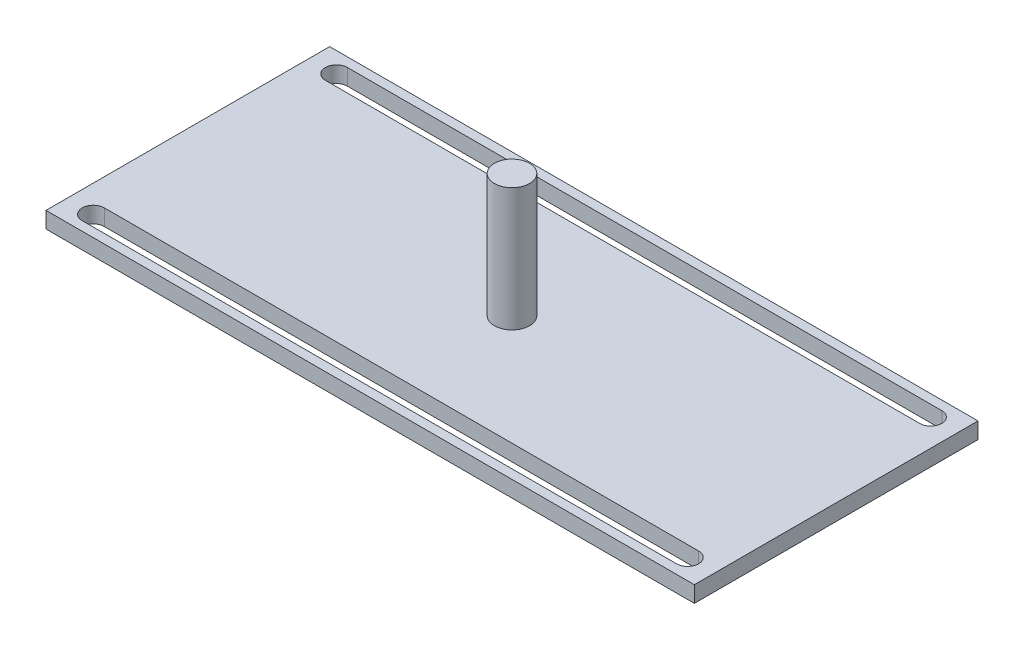
ISO-10303-21;
HEADER;
FILE_DESCRIPTION(('STEP AP214'),'2;1');
FILE_NAME('part.step','',(''),(''),'','','');
FILE_SCHEMA(('AUTOMOTIVE_DESIGN { 1 0 10303 214 1 1 1 1 }'));
ENDSEC;
DATA;
#1=APPLICATION_CONTEXT('core data for automotive mechanical design processes');
#2=APPLICATION_PROTOCOL_DEFINITION('international standard','automotive_design',2000,#1);
#3=PRODUCT_CONTEXT('',#1,'mechanical');
#4=PRODUCT('Part','Part','',(#3));
#5=PRODUCT_RELATED_PRODUCT_CATEGORY('part','',(#4));
#6=PRODUCT_DEFINITION_FORMATION('','',#4);
#7=PRODUCT_DEFINITION_CONTEXT('part definition',#1,'design');
#8=PRODUCT_DEFINITION('design','',#6,#7);
#9=PRODUCT_DEFINITION_SHAPE('','',#8);
#10=(LENGTH_UNIT() NAMED_UNIT(*) SI_UNIT(.MILLI.,.METRE.));
#11=(NAMED_UNIT(*) PLANE_ANGLE_UNIT() SI_UNIT($,.RADIAN.));
#12=(NAMED_UNIT(*) SI_UNIT($,.STERADIAN.) SOLID_ANGLE_UNIT());
#13=UNCERTAINTY_MEASURE_WITH_UNIT(LENGTH_MEASURE(1.E-05),#10,'distance_accuracy_value','');
#14=(GEOMETRIC_REPRESENTATION_CONTEXT(3) GLOBAL_UNCERTAINTY_ASSIGNED_CONTEXT((#13)) GLOBAL_UNIT_ASSIGNED_CONTEXT((#10,
#11,#12)) REPRESENTATION_CONTEXT('',''));
#15=CARTESIAN_POINT('',(0.,0.,0.));
#16=DIRECTION('',(0.,0.,1.));
#17=DIRECTION('',(1.,0.,0.));
#18=AXIS2_PLACEMENT_3D('',#15,#16,#17);
#19=CARTESIAN_POINT('',(0.,6.,0.));
#20=DIRECTION('',(0.,1.,0.));
#21=DIRECTION('',(0.,0.,1.));
#22=AXIS2_PLACEMENT_3D('',#19,#20,#21);
#23=PLANE('',#22);
#24=CARTESIAN_POINT('',(24.5236212747906,6.,-78.038808084481));
#25=DIRECTION('',(0.,1.,0.));
#26=DIRECTION('',(0.,0.,1.));
#27=AXIS2_PLACEMENT_3D('',#24,#25,#26);
#28=CIRCLE('',#27,4.09999999999998);
#29=CARTESIAN_POINT('',(24.5236212747906,6.00000000000001,-73.938808084481));
#30=VERTEX_POINT('',#29);
#31=CARTESIAN_POINT('',(24.5236212747906,6.00000000000001,-82.138808084481));
#32=VERTEX_POINT('',#31);
#33=EDGE_CURVE('E207',#30,#32,#28,.T.);
#34=ORIENTED_EDGE('',*,*,#33,.F.);
#35=DIRECTION('',(-1.,0.,0.));
#36=VECTOR('',#35,1.);
#37=CARTESIAN_POINT('',(0.,6.,-73.938808084481));
#38=LINE('',#37,#36);
#39=CARTESIAN_POINT('',(-195.476378725209,6.00000000000001,-73.938808084481));
#40=VERTEX_POINT('',#39);
#41=EDGE_CURVE('E237',#30,#40,#38,.T.);
#42=ORIENTED_EDGE('',*,*,#41,.T.);
#43=CARTESIAN_POINT('',(-195.476378725209,6.,-78.038808084481));
#44=DIRECTION('',(0.,1.,0.));
#45=DIRECTION('',(0.,0.,1.));
#46=AXIS2_PLACEMENT_3D('',#43,#44,#45);
#47=CIRCLE('',#46,4.09999999999998);
#48=CARTESIAN_POINT('',(-195.476378725209,6.,-82.138808084481));
#49=VERTEX_POINT('',#48);
#50=EDGE_CURVE('E172',#49,#40,#47,.T.);
#51=ORIENTED_EDGE('',*,*,#50,.F.);
#52=DIRECTION('',(1.,0.,0.));
#53=VECTOR('',#52,1.);
#54=CARTESIAN_POINT('',(0.,6.,-82.138808084481));
#55=LINE('',#54,#53);
#56=EDGE_CURVE('E67',#49,#32,#55,.T.);
#57=ORIENTED_EDGE('',*,*,#56,.T.);
#58=EDGE_LOOP('',(#34,#42,#51,#57));
#59=FACE_BOUND('',#58,.T.);
#60=CARTESIAN_POINT('',(-85.4763787252094,6.,-33.038808084481));
#61=DIRECTION('',(0.,1.,0.));
#62=DIRECTION('',(0.,0.,1.));
#63=AXIS2_PLACEMENT_3D('',#60,#61,#62);
#64=CIRCLE('',#63,6.5);
#65=CARTESIAN_POINT('',(-85.4763787252094,6.,-26.538808084481));
#66=VERTEX_POINT('',#65);
#67=EDGE_CURVE('E163',#66,#66,#64,.T.);
#68=ORIENTED_EDGE('',*,*,#67,.F.);
#69=EDGE_LOOP('',(#68));
#70=FACE_BOUND('',#69,.T.);
#71=DIRECTION('',(0.,0.,1.));
#72=VECTOR('',#71,1.);
#73=CARTESIAN_POINT('',(-205.476378725209,6.,-85.538808084481));
#74=LINE('',#73,#72);
#75=CARTESIAN_POINT('',(-205.476378725209,6.,-85.538808084481));
#76=VERTEX_POINT('',#75);
#77=CARTESIAN_POINT('',(-205.476378725209,6.,19.461191915519));
#78=VERTEX_POINT('',#77);
#79=EDGE_CURVE('E178',#76,#78,#74,.T.);
#80=ORIENTED_EDGE('',*,*,#79,.T.);
#81=DIRECTION('',(1.,0.,0.));
#82=VECTOR('',#81,1.);
#83=CARTESIAN_POINT('',(-205.476378725209,6.,19.461191915519));
#84=LINE('',#83,#82);
#85=CARTESIAN_POINT('',(34.5236212747906,6.,19.461191915519));
#86=VERTEX_POINT('',#85);
#87=EDGE_CURVE('E181',#78,#86,#84,.T.);
#88=ORIENTED_EDGE('',*,*,#87,.T.);
#89=DIRECTION('',(0.,0.,-1.));
#90=VECTOR('',#89,1.);
#91=CARTESIAN_POINT('',(34.5236212747905,6.,-85.538808084481));
#92=LINE('',#91,#90);
#93=CARTESIAN_POINT('',(34.5236212747905,6.,-85.538808084481));
#94=VERTEX_POINT('',#93);
#95=EDGE_CURVE('E184',#86,#94,#92,.T.);
#96=ORIENTED_EDGE('',*,*,#95,.T.);
#97=DIRECTION('',(-1.,0.,0.));
#98=VECTOR('',#97,1.);
#99=CARTESIAN_POINT('',(-205.476378725209,6.,-85.538808084481));
#100=LINE('',#99,#98);
#101=EDGE_CURVE('E186',#94,#76,#100,.T.);
#102=ORIENTED_EDGE('',*,*,#101,.T.);
#103=EDGE_LOOP('',(#80,#88,#96,#102));
#104=FACE_BOUND('',#103,.T.);
#105=DIRECTION('',(-1.,0.,0.));
#106=VECTOR('',#105,1.);
#107=CARTESIAN_POINT('',(0.,6.,7.86119191551908));
#108=LINE('',#107,#106);
#109=CARTESIAN_POINT('',(24.5236212747906,6.00000000000001,7.86119191551905));
#110=VERTEX_POINT('',#109);
#111=CARTESIAN_POINT('',(-195.476378725209,6.00000000000001,7.86119191551905));
#112=VERTEX_POINT('',#111);
#113=EDGE_CURVE('E228',#110,#112,#108,.T.);
#114=ORIENTED_EDGE('',*,*,#113,.F.);
#115=CARTESIAN_POINT('',(24.5236212747906,6.,11.961191915519));
#116=DIRECTION('',(0.,-1.,0.));
#117=DIRECTION('',(0.,0.,-1.));
#118=AXIS2_PLACEMENT_3D('',#115,#116,#117);
#119=CIRCLE('',#118,4.09999999999998);
#120=CARTESIAN_POINT('',(24.5236212747906,6.00000000000001,16.061191915519));
#121=VERTEX_POINT('',#120);
#122=EDGE_CURVE('E158',#110,#121,#119,.T.);
#123=ORIENTED_EDGE('',*,*,#122,.T.);
#124=DIRECTION('',(1.,0.,0.));
#125=VECTOR('',#124,1.);
#126=CARTESIAN_POINT('',(0.,6.,16.061191915519));
#127=LINE('',#126,#125);
#128=CARTESIAN_POINT('',(-195.476378725209,6.00000000000001,16.061191915519));
#129=VERTEX_POINT('',#128);
#130=EDGE_CURVE('E151',#129,#121,#127,.T.);
#131=ORIENTED_EDGE('',*,*,#130,.F.);
#132=CARTESIAN_POINT('',(-195.476378725209,6.,11.961191915519));
#133=DIRECTION('',(0.,-1.,0.));
#134=DIRECTION('',(0.,0.,-1.));
#135=AXIS2_PLACEMENT_3D('',#132,#133,#134);
#136=CIRCLE('',#135,4.09999999999998);
#137=EDGE_CURVE('E167',#129,#112,#136,.T.);
#138=ORIENTED_EDGE('',*,*,#137,.T.);
#139=EDGE_LOOP('',(#114,#123,#131,#138));
#140=FACE_BOUND('',#139,.T.);
#141=ADVANCED_FACE('F44',(#59,#70,#104,#140),#23,.T.);
#142=CARTESIAN_POINT('',(0.,0.,0.));
#143=DIRECTION('',(0.,1.,0.));
#144=DIRECTION('',(0.,0.,1.));
#145=AXIS2_PLACEMENT_3D('',#142,#143,#144);
#146=PLANE('',#145);
#147=DIRECTION('',(0.,0.,1.));
#148=VECTOR('',#147,1.);
#149=CARTESIAN_POINT('',(-205.476378725209,0.,-85.538808084481));
#150=LINE('',#149,#148);
#151=CARTESIAN_POINT('',(-205.476378725209,0.,-85.538808084481));
#152=VERTEX_POINT('',#151);
#153=CARTESIAN_POINT('',(-205.476378725209,0.,19.461191915519));
#154=VERTEX_POINT('',#153);
#155=EDGE_CURVE('E175',#152,#154,#150,.T.);
#156=ORIENTED_EDGE('',*,*,#155,.F.);
#157=DIRECTION('',(-1.,0.,0.));
#158=VECTOR('',#157,1.);
#159=CARTESIAN_POINT('',(-205.476378725209,0.,-85.538808084481));
#160=LINE('',#159,#158);
#161=CARTESIAN_POINT('',(34.5236212747905,0.,-85.538808084481));
#162=VERTEX_POINT('',#161);
#163=EDGE_CURVE('E182',#162,#152,#160,.T.);
#164=ORIENTED_EDGE('',*,*,#163,.F.);
#165=DIRECTION('',(0.,0.,-1.));
#166=VECTOR('',#165,1.);
#167=CARTESIAN_POINT('',(34.5236212747905,0.,-85.538808084481));
#168=LINE('',#167,#166);
#169=CARTESIAN_POINT('',(34.5236212747906,0.,19.461191915519));
#170=VERTEX_POINT('',#169);
#171=EDGE_CURVE('E193',#170,#162,#168,.T.);
#172=ORIENTED_EDGE('',*,*,#171,.F.);
#173=DIRECTION('',(1.,0.,0.));
#174=VECTOR('',#173,1.);
#175=CARTESIAN_POINT('',(-205.476378725209,0.,19.461191915519));
#176=LINE('',#175,#174);
#177=EDGE_CURVE('E191',#154,#170,#176,.T.);
#178=ORIENTED_EDGE('',*,*,#177,.F.);
#179=EDGE_LOOP('',(#156,#164,#172,#178));
#180=FACE_BOUND('',#179,.T.);
#181=DIRECTION('',(1.,0.,0.));
#182=VECTOR('',#181,1.);
#183=CARTESIAN_POINT('',(-85.4763787252094,0.,-73.938808084481));
#184=LINE('',#183,#182);
#185=CARTESIAN_POINT('',(-195.476378725209,0.,-73.938808084481));
#186=VERTEX_POINT('',#185);
#187=CARTESIAN_POINT('',(24.5236212747906,0.,-73.938808084481));
#188=VERTEX_POINT('',#187);
#189=EDGE_CURVE('E59',#186,#188,#184,.T.);
#190=ORIENTED_EDGE('',*,*,#189,.T.);
#191=CARTESIAN_POINT('',(24.5236212747906,0.,-78.038808084481));
#192=DIRECTION('',(0.,1.,0.));
#193=DIRECTION('',(0.,0.,1.));
#194=AXIS2_PLACEMENT_3D('',#191,#192,#193);
#195=CIRCLE('',#194,4.09999999999998);
#196=CARTESIAN_POINT('',(24.5236212747906,0.,-82.138808084481));
#197=VERTEX_POINT('',#196);
#198=EDGE_CURVE('E155',#188,#197,#195,.T.);
#199=ORIENTED_EDGE('',*,*,#198,.T.);
#200=DIRECTION('',(-1.,0.,0.));
#201=VECTOR('',#200,1.);
#202=CARTESIAN_POINT('',(-195.476378725209,0.,-82.138808084481));
#203=LINE('',#202,#201);
#204=CARTESIAN_POINT('',(-195.476378725209,0.,-82.138808084481));
#205=VERTEX_POINT('',#204);
#206=EDGE_CURVE('E213',#197,#205,#203,.T.);
#207=ORIENTED_EDGE('',*,*,#206,.T.);
#208=CARTESIAN_POINT('',(-195.476378725209,0.,-78.038808084481));
#209=DIRECTION('',(0.,1.,0.));
#210=DIRECTION('',(0.,0.,1.));
#211=AXIS2_PLACEMENT_3D('',#208,#209,#210);
#212=CIRCLE('',#211,4.09999999999998);
#213=EDGE_CURVE('E170',#205,#186,#212,.T.);
#214=ORIENTED_EDGE('',*,*,#213,.T.);
#215=EDGE_LOOP('',(#190,#199,#207,#214));
#216=FACE_BOUND('',#215,.T.);
#217=CARTESIAN_POINT('',(24.5236212747906,0.,11.961191915519));
#218=DIRECTION('',(0.,-1.,0.));
#219=DIRECTION('',(0.,0.,-1.));
#220=AXIS2_PLACEMENT_3D('',#217,#218,#219);
#221=CIRCLE('',#220,4.09999999999998);
#222=CARTESIAN_POINT('',(24.5236212747906,0.,7.86119191551905));
#223=VERTEX_POINT('',#222);
#224=CARTESIAN_POINT('',(24.5236212747906,0.,16.061191915519));
#225=VERTEX_POINT('',#224);
#226=EDGE_CURVE('E140',#223,#225,#221,.T.);
#227=ORIENTED_EDGE('',*,*,#226,.F.);
#228=DIRECTION('',(1.,0.,0.));
#229=VECTOR('',#228,1.);
#230=CARTESIAN_POINT('',(-85.4763787252094,0.,7.86119191551907));
#231=LINE('',#230,#229);
#232=CARTESIAN_POINT('',(-195.476378725209,0.,7.86119191551905));
#233=VERTEX_POINT('',#232);
#234=EDGE_CURVE('E146',#233,#223,#231,.T.);
#235=ORIENTED_EDGE('',*,*,#234,.F.);
#236=CARTESIAN_POINT('',(-195.476378725209,0.,11.961191915519));
#237=DIRECTION('',(0.,-1.,0.));
#238=DIRECTION('',(0.,0.,-1.));
#239=AXIS2_PLACEMENT_3D('',#236,#237,#238);
#240=CIRCLE('',#239,4.09999999999998);
#241=CARTESIAN_POINT('',(-195.476378725209,0.,16.061191915519));
#242=VERTEX_POINT('',#241);
#243=EDGE_CURVE('E142',#242,#233,#240,.T.);
#244=ORIENTED_EDGE('',*,*,#243,.F.);
#245=DIRECTION('',(-1.,0.,0.));
#246=VECTOR('',#245,1.);
#247=CARTESIAN_POINT('',(-195.476378725209,0.,16.061191915519));
#248=LINE('',#247,#246);
#249=EDGE_CURVE('E135',#225,#242,#248,.T.);
#250=ORIENTED_EDGE('',*,*,#249,.F.);
#251=EDGE_LOOP('',(#227,#235,#244,#250));
#252=FACE_BOUND('',#251,.T.);
#253=ADVANCED_FACE('F137',(#180,#216,#252),#146,.F.);
#254=CARTESIAN_POINT('',(24.5236212747906,6.,11.961191915519));
#255=DIRECTION('',(0.,-1.,0.));
#256=DIRECTION('',(0.,0.,-1.));
#257=AXIS2_PLACEMENT_3D('',#254,#255,#256);
#258=CYLINDRICAL_SURFACE('',#257,4.09999999999998);
#259=DIRECTION('',(0.,-1.,0.));
#260=VECTOR('',#259,1.);
#261=CARTESIAN_POINT('',(24.5236212747906,6.,7.86119191551906));
#262=LINE('',#261,#260);
#263=EDGE_CURVE('E11',#223,#110,#262,.F.);
#264=ORIENTED_EDGE('',*,*,#263,.F.);
#265=ORIENTED_EDGE('',*,*,#226,.T.);
#266=DIRECTION('',(0.,-1.,0.));
#267=VECTOR('',#266,1.);
#268=CARTESIAN_POINT('',(24.5236212747906,6.,16.061191915519));
#269=LINE('',#268,#267);
#270=EDGE_CURVE('E52',#121,#225,#269,.T.);
#271=ORIENTED_EDGE('',*,*,#270,.F.);
#272=ORIENTED_EDGE('',*,*,#122,.F.);
#273=EDGE_LOOP('',(#264,#265,#271,#272));
#274=FACE_BOUND('',#273,.T.);
#275=ADVANCED_FACE('F157',(#274),#258,.F.);
#276=CARTESIAN_POINT('',(-195.476378725209,6.,-78.038808084481));
#277=DIRECTION('',(0.,-1.,0.));
#278=DIRECTION('',(0.,0.,-1.));
#279=AXIS2_PLACEMENT_3D('',#276,#277,#278);
#280=CYLINDRICAL_SURFACE('',#279,4.09999999999998);
#281=ORIENTED_EDGE('',*,*,#50,.T.);
#282=DIRECTION('',(0.,-1.,0.));
#283=VECTOR('',#282,1.);
#284=CARTESIAN_POINT('',(-195.476378725209,51.6,-73.938808084481));
#285=LINE('',#284,#283);
#286=EDGE_CURVE('E232',#40,#186,#285,.T.);
#287=ORIENTED_EDGE('',*,*,#286,.T.);
#288=ORIENTED_EDGE('',*,*,#213,.F.);
#289=DIRECTION('',(0.,-1.,0.));
#290=VECTOR('',#289,1.);
#291=CARTESIAN_POINT('',(-195.476378725209,51.6,-82.138808084481));
#292=LINE('',#291,#290);
#293=EDGE_CURVE('E234',#49,#205,#292,.T.);
#294=ORIENTED_EDGE('',*,*,#293,.F.);
#295=EDGE_LOOP('',(#281,#287,#288,#294));
#296=FACE_BOUND('',#295,.T.);
#297=ADVANCED_FACE('F273',(#296),#280,.F.);
#298=CARTESIAN_POINT('',(24.5236212747906,6.,-78.038808084481));
#299=DIRECTION('',(0.,-1.,0.));
#300=DIRECTION('',(0.,0.,-1.));
#301=AXIS2_PLACEMENT_3D('',#298,#299,#300);
#302=CYLINDRICAL_SURFACE('',#301,4.09999999999998);
#303=DIRECTION('',(0.,-1.,0.));
#304=VECTOR('',#303,1.);
#305=CARTESIAN_POINT('',(24.5236212747906,51.6,-73.938808084481));
#306=LINE('',#305,#304);
#307=EDGE_CURVE('E217',#30,#188,#306,.T.);
#308=ORIENTED_EDGE('',*,*,#307,.F.);
#309=ORIENTED_EDGE('',*,*,#33,.T.);
#310=DIRECTION('',(0.,-1.,0.));
#311=VECTOR('',#310,1.);
#312=CARTESIAN_POINT('',(24.5236212747906,51.6,-82.138808084481));
#313=LINE('',#312,#311);
#314=EDGE_CURVE('E219',#32,#197,#313,.T.);
#315=ORIENTED_EDGE('',*,*,#314,.T.);
#316=ORIENTED_EDGE('',*,*,#198,.F.);
#317=EDGE_LOOP('',(#308,#309,#315,#316));
#318=FACE_BOUND('',#317,.T.);
#319=ADVANCED_FACE('F46',(#318),#302,.F.);
#320=CARTESIAN_POINT('',(-205.476378725209,6.,-85.538808084481));
#321=DIRECTION('',(1.,0.,0.));
#322=DIRECTION('',(0.,0.,-1.));
#323=AXIS2_PLACEMENT_3D('',#320,#321,#322);
#324=PLANE('',#323);
#325=ORIENTED_EDGE('',*,*,#155,.T.);
#326=DIRECTION('',(0.,-1.,0.));
#327=VECTOR('',#326,1.);
#328=CARTESIAN_POINT('',(-205.476378725209,6.,19.461191915519));
#329=LINE('',#328,#327);
#330=EDGE_CURVE('E204',#78,#154,#329,.T.);
#331=ORIENTED_EDGE('',*,*,#330,.F.);
#332=ORIENTED_EDGE('',*,*,#79,.F.);
#333=DIRECTION('',(0.,-1.,0.));
#334=VECTOR('',#333,1.);
#335=CARTESIAN_POINT('',(-205.476378725209,6.,-85.538808084481));
#336=LINE('',#335,#334);
#337=EDGE_CURVE('E188',#76,#152,#336,.T.);
#338=ORIENTED_EDGE('',*,*,#337,.T.);
#339=EDGE_LOOP('',(#325,#331,#332,#338));
#340=FACE_BOUND('',#339,.T.);
#341=ADVANCED_FACE('F284',(#340),#324,.F.);
#342=CARTESIAN_POINT('',(-205.476378725209,6.,19.461191915519));
#343=DIRECTION('',(0.,0.,-1.));
#344=DIRECTION('',(-1.,0.,0.));
#345=AXIS2_PLACEMENT_3D('',#342,#343,#344);
#346=PLANE('',#345);
#347=ORIENTED_EDGE('',*,*,#177,.T.);
#348=DIRECTION('',(0.,-1.,0.));
#349=VECTOR('',#348,1.);
#350=CARTESIAN_POINT('',(34.5236212747906,6.,19.461191915519));
#351=LINE('',#350,#349);
#352=EDGE_CURVE('E201',#86,#170,#351,.T.);
#353=ORIENTED_EDGE('',*,*,#352,.F.);
#354=ORIENTED_EDGE('',*,*,#87,.F.);
#355=ORIENTED_EDGE('',*,*,#330,.T.);
#356=EDGE_LOOP('',(#347,#353,#354,#355));
#357=FACE_BOUND('',#356,.T.);
#358=ADVANCED_FACE('F281',(#357),#346,.F.);
#359=CARTESIAN_POINT('',(34.5236212747905,6.,-85.538808084481));
#360=DIRECTION('',(-1.,0.,0.));
#361=DIRECTION('',(0.,0.,1.));
#362=AXIS2_PLACEMENT_3D('',#359,#360,#361);
#363=PLANE('',#362);
#364=ORIENTED_EDGE('',*,*,#171,.T.);
#365=DIRECTION('',(0.,-1.,0.));
#366=VECTOR('',#365,1.);
#367=CARTESIAN_POINT('',(34.5236212747905,6.,-85.538808084481));
#368=LINE('',#367,#366);
#369=EDGE_CURVE('E198',#94,#162,#368,.T.);
#370=ORIENTED_EDGE('',*,*,#369,.F.);
#371=ORIENTED_EDGE('',*,*,#95,.F.);
#372=ORIENTED_EDGE('',*,*,#352,.T.);
#373=EDGE_LOOP('',(#364,#370,#371,#372));
#374=FACE_BOUND('',#373,.T.);
#375=ADVANCED_FACE('F268',(#374),#363,.F.);
#376=CARTESIAN_POINT('',(-205.476378725209,6.,-85.538808084481));
#377=DIRECTION('',(0.,0.,1.));
#378=DIRECTION('',(1.,0.,0.));
#379=AXIS2_PLACEMENT_3D('',#376,#377,#378);
#380=PLANE('',#379);
#381=ORIENTED_EDGE('',*,*,#163,.T.);
#382=ORIENTED_EDGE('',*,*,#337,.F.);
#383=ORIENTED_EDGE('',*,*,#101,.F.);
#384=ORIENTED_EDGE('',*,*,#369,.T.);
#385=EDGE_LOOP('',(#381,#382,#383,#384));
#386=FACE_BOUND('',#385,.T.);
#387=ADVANCED_FACE('F257',(#386),#380,.F.);
#388=CARTESIAN_POINT('',(-195.476378725209,6.,11.961191915519));
#389=DIRECTION('',(0.,-1.,0.));
#390=DIRECTION('',(0.,0.,-1.));
#391=AXIS2_PLACEMENT_3D('',#388,#389,#390);
#392=CYLINDRICAL_SURFACE('',#391,4.09999999999998);
#393=ORIENTED_EDGE('',*,*,#243,.T.);
#394=DIRECTION('',(0.,-1.,0.));
#395=VECTOR('',#394,1.);
#396=CARTESIAN_POINT('',(-195.476378725209,51.6,7.86119191551905));
#397=LINE('',#396,#395);
#398=EDGE_CURVE('E225',#112,#233,#397,.T.);
#399=ORIENTED_EDGE('',*,*,#398,.F.);
#400=ORIENTED_EDGE('',*,*,#137,.F.);
#401=DIRECTION('',(0.,-1.,0.));
#402=VECTOR('',#401,1.);
#403=CARTESIAN_POINT('',(-195.476378725209,51.6,16.061191915519));
#404=LINE('',#403,#402);
#405=EDGE_CURVE('E145',#129,#242,#404,.T.);
#406=ORIENTED_EDGE('',*,*,#405,.T.);
#407=EDGE_LOOP('',(#393,#399,#400,#406));
#408=FACE_BOUND('',#407,.T.);
#409=ADVANCED_FACE('F255',(#408),#392,.F.);
#410=CARTESIAN_POINT('',(-85.4763787252094,51.6,-33.038808084481));
#411=DIRECTION('',(0.,-1.,0.));
#412=DIRECTION('',(0.,0.,-1.));
#413=AXIS2_PLACEMENT_3D('',#410,#411,#412);
#414=CYLINDRICAL_SURFACE('',#413,6.5);
#415=CARTESIAN_POINT('',(-85.4763787252094,51.6,-33.038808084481));
#416=DIRECTION('',(0.,1.,0.));
#417=DIRECTION('',(0.,0.,1.));
#418=AXIS2_PLACEMENT_3D('',#415,#416,#417);
#419=CIRCLE('',#418,6.5);
#420=CARTESIAN_POINT('',(-85.4763787252094,51.6,-26.538808084481));
#421=VERTEX_POINT('',#420);
#422=EDGE_CURVE('E159',#421,#421,#419,.T.);
#423=ORIENTED_EDGE('',*,*,#422,.F.);
#424=EDGE_LOOP('',(#423));
#425=FACE_BOUND('',#424,.T.);
#426=ORIENTED_EDGE('',*,*,#67,.T.);
#427=EDGE_LOOP('',(#426));
#428=FACE_BOUND('',#427,.T.);
#429=ADVANCED_FACE('F241',(#425,#428),#414,.T.);
#430=CARTESIAN_POINT('',(-85.4763787252094,51.6,-33.038808084481));
#431=DIRECTION('',(0.,1.,0.));
#432=DIRECTION('',(0.,0.,1.));
#433=AXIS2_PLACEMENT_3D('',#430,#431,#432);
#434=PLANE('',#433);
#435=ORIENTED_EDGE('',*,*,#422,.T.);
#436=EDGE_LOOP('',(#435));
#437=FACE_BOUND('',#436,.T.);
#438=ADVANCED_FACE('F264',(#437),#434,.T.);
#439=CARTESIAN_POINT('',(-195.476378725209,51.6,-82.138808084481));
#440=DIRECTION('',(0.,0.,1.));
#441=DIRECTION('',(1.,0.,0.));
#442=AXIS2_PLACEMENT_3D('',#439,#440,#441);
#443=PLANE('',#442);
#444=ORIENTED_EDGE('',*,*,#293,.T.);
#445=ORIENTED_EDGE('',*,*,#206,.F.);
#446=ORIENTED_EDGE('',*,*,#314,.F.);
#447=ORIENTED_EDGE('',*,*,#56,.F.);
#448=EDGE_LOOP('',(#444,#445,#446,#447));
#449=FACE_BOUND('',#448,.T.);
#450=ADVANCED_FACE('F322',(#449),#443,.T.);
#451=CARTESIAN_POINT('',(-85.4763787252094,51.6,-73.938808084481));
#452=DIRECTION('',(0.,0.,-1.));
#453=DIRECTION('',(-1.,0.,0.));
#454=AXIS2_PLACEMENT_3D('',#451,#452,#453);
#455=PLANE('',#454);
#456=ORIENTED_EDGE('',*,*,#286,.F.);
#457=ORIENTED_EDGE('',*,*,#41,.F.);
#458=ORIENTED_EDGE('',*,*,#307,.T.);
#459=ORIENTED_EDGE('',*,*,#189,.F.);
#460=EDGE_LOOP('',(#456,#457,#458,#459));
#461=FACE_BOUND('',#460,.T.);
#462=ADVANCED_FACE('F326',(#461),#455,.T.);
#463=CARTESIAN_POINT('',(-85.4763787252094,51.6,7.86119191551907));
#464=DIRECTION('',(0.,0.,-1.));
#465=DIRECTION('',(-1.,0.,0.));
#466=AXIS2_PLACEMENT_3D('',#463,#464,#465);
#467=PLANE('',#466);
#468=ORIENTED_EDGE('',*,*,#113,.T.);
#469=ORIENTED_EDGE('',*,*,#398,.T.);
#470=ORIENTED_EDGE('',*,*,#234,.T.);
#471=ORIENTED_EDGE('',*,*,#263,.T.);
#472=EDGE_LOOP('',(#468,#469,#470,#471));
#473=FACE_BOUND('',#472,.T.);
#474=ADVANCED_FACE('F253',(#473),#467,.F.);
#475=CARTESIAN_POINT('',(-195.476378725209,51.6,16.061191915519));
#476=DIRECTION('',(0.,0.,1.));
#477=DIRECTION('',(1.,0.,0.));
#478=AXIS2_PLACEMENT_3D('',#475,#476,#477);
#479=PLANE('',#478);
#480=ORIENTED_EDGE('',*,*,#130,.T.);
#481=ORIENTED_EDGE('',*,*,#270,.T.);
#482=ORIENTED_EDGE('',*,*,#249,.T.);
#483=ORIENTED_EDGE('',*,*,#405,.F.);
#484=EDGE_LOOP('',(#480,#481,#482,#483));
#485=FACE_BOUND('',#484,.T.);
#486=ADVANCED_FACE('F149',(#485),#479,.F.);
#487=CLOSED_SHELL('',(#141,#253,#275,#297,#319,#341,#358,#375,#387,#409,#429,#438,#450,#462,
#474,#486));
#488=MANIFOLD_SOLID_BREP('B2',#487);
#489=ADVANCED_BREP_SHAPE_REPRESENTATION('',(#18,#488),#14);
#490=SHAPE_DEFINITION_REPRESENTATION(#9,#489);
ENDSEC;
END-ISO-10303-21;
